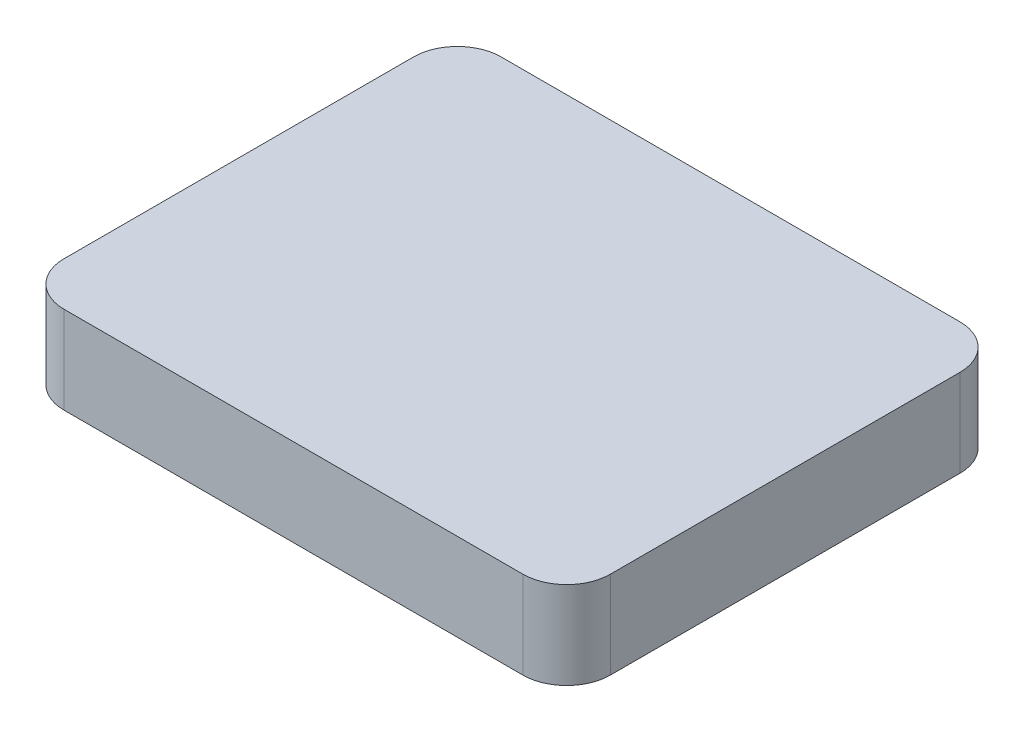
ISO-10303-21;
HEADER;
FILE_DESCRIPTION(('STEP AP214'),'2;1');
FILE_NAME('part.step','',(''),(''),'','','');
FILE_SCHEMA(('AUTOMOTIVE_DESIGN { 1 0 10303 214 1 1 1 1 }'));
ENDSEC;
DATA;
#1=APPLICATION_CONTEXT('core data for automotive mechanical design processes');
#2=APPLICATION_PROTOCOL_DEFINITION('international standard','automotive_design',2000,#1);
#3=PRODUCT_CONTEXT('',#1,'mechanical');
#4=PRODUCT('Part','Part','',(#3));
#5=PRODUCT_RELATED_PRODUCT_CATEGORY('part','',(#4));
#6=PRODUCT_DEFINITION_FORMATION('','',#4);
#7=PRODUCT_DEFINITION_CONTEXT('part definition',#1,'design');
#8=PRODUCT_DEFINITION('design','',#6,#7);
#9=PRODUCT_DEFINITION_SHAPE('','',#8);
#10=(LENGTH_UNIT() NAMED_UNIT(*) SI_UNIT(.MILLI.,.METRE.));
#11=(NAMED_UNIT(*) PLANE_ANGLE_UNIT() SI_UNIT($,.RADIAN.));
#12=(NAMED_UNIT(*) SI_UNIT($,.STERADIAN.) SOLID_ANGLE_UNIT());
#13=UNCERTAINTY_MEASURE_WITH_UNIT(LENGTH_MEASURE(1.E-05),#10,'distance_accuracy_value','');
#14=(GEOMETRIC_REPRESENTATION_CONTEXT(3) GLOBAL_UNCERTAINTY_ASSIGNED_CONTEXT((#13)) GLOBAL_UNIT_ASSIGNED_CONTEXT((#10,
#11,#12)) REPRESENTATION_CONTEXT('',''));
#15=CARTESIAN_POINT('',(0.,0.,0.));
#16=DIRECTION('',(0.,0.,1.));
#17=DIRECTION('',(1.,0.,0.));
#18=AXIS2_PLACEMENT_3D('',#15,#16,#17);
#19=CARTESIAN_POINT('',(-57.7415976312723,40.,-64.0212264150943));
#20=DIRECTION('',(0.,-1.,0.));
#21=DIRECTION('',(0.,0.,-1.));
#22=AXIS2_PLACEMENT_3D('',#19,#20,#21);
#23=CYLINDRICAL_SURFACE('',#22,20.);
#24=CARTESIAN_POINT('',(-57.7415976312723,0.,-64.0212264150943));
#25=DIRECTION('',(0.,1.,0.));
#26=DIRECTION('',(0.,0.,-1.));
#27=AXIS2_PLACEMENT_3D('',#24,#25,#26);
#28=CIRCLE('',#27,20.);
#29=CARTESIAN_POINT('',(-57.7415976312721,0.,-84.0212264150943));
#30=VERTEX_POINT('',#29);
#31=CARTESIAN_POINT('',(-77.7415976312723,0.,-64.0212264150942));
#32=VERTEX_POINT('',#31);
#33=EDGE_CURVE('E128',#30,#32,#28,.T.);
#34=ORIENTED_EDGE('',*,*,#33,.T.);
#35=DIRECTION('',(0.,-1.,0.));
#36=VECTOR('',#35,1.);
#37=CARTESIAN_POINT('',(-77.7415976312723,40.,-64.0212264150942));
#38=LINE('',#37,#36);
#39=CARTESIAN_POINT('',(-77.7415976312723,40.,-64.0212264150942));
#40=VERTEX_POINT('',#39);
#41=EDGE_CURVE('E11',#40,#32,#38,.T.);
#42=ORIENTED_EDGE('',*,*,#41,.F.);
#43=CARTESIAN_POINT('',(-57.7415976312723,40.,-64.0212264150943));
#44=DIRECTION('',(0.,1.,0.));
#45=DIRECTION('',(0.,0.,-1.));
#46=AXIS2_PLACEMENT_3D('',#43,#44,#45);
#47=CIRCLE('',#46,20.);
#48=CARTESIAN_POINT('',(-57.7415976312721,40.,-84.0212264150943));
#49=VERTEX_POINT('',#48);
#50=EDGE_CURVE('E142',#49,#40,#47,.T.);
#51=ORIENTED_EDGE('',*,*,#50,.F.);
#52=DIRECTION('',(0.,-1.,0.));
#53=VECTOR('',#52,1.);
#54=CARTESIAN_POINT('',(-57.7415976312721,40.,-84.0212264150943));
#55=LINE('',#54,#53);
#56=EDGE_CURVE('E124',#49,#30,#55,.T.);
#57=ORIENTED_EDGE('',*,*,#56,.T.);
#58=EDGE_LOOP('',(#34,#42,#51,#57));
#59=FACE_BOUND('',#58,.T.);
#60=ADVANCED_FACE('F32',(#59),#23,.T.);
#61=CARTESIAN_POINT('',(-77.7415976312723,40.,95.9787735849055));
#62=DIRECTION('',(1.,0.,0.));
#63=DIRECTION('',(0.,0.,-1.));
#64=AXIS2_PLACEMENT_3D('',#61,#62,#63);
#65=PLANE('',#64);
#66=DIRECTION('',(0.,0.,1.));
#67=VECTOR('',#66,1.);
#68=CARTESIAN_POINT('',(-77.7415976312723,0.,95.9787735849055));
#69=LINE('',#68,#67);
#70=CARTESIAN_POINT('',(-77.7415976312723,0.,95.9787735849055));
#71=VERTEX_POINT('',#70);
#72=EDGE_CURVE('E131',#32,#71,#69,.T.);
#73=ORIENTED_EDGE('',*,*,#72,.T.);
#74=DIRECTION('',(0.,-1.,0.));
#75=VECTOR('',#74,1.);
#76=CARTESIAN_POINT('',(-77.7415976312723,40.,95.9787735849055));
#77=LINE('',#76,#75);
#78=CARTESIAN_POINT('',(-77.7415976312723,40.,95.9787735849055));
#79=VERTEX_POINT('',#78);
#80=EDGE_CURVE('E40',#79,#71,#77,.T.);
#81=ORIENTED_EDGE('',*,*,#80,.F.);
#82=DIRECTION('',(0.,0.,1.));
#83=VECTOR('',#82,1.);
#84=CARTESIAN_POINT('',(-77.7415976312723,40.,95.9787735849055));
#85=LINE('',#84,#83);
#86=EDGE_CURVE('E91',#40,#79,#85,.T.);
#87=ORIENTED_EDGE('',*,*,#86,.F.);
#88=ORIENTED_EDGE('',*,*,#41,.T.);
#89=EDGE_LOOP('',(#73,#81,#87,#88));
#90=FACE_BOUND('',#89,.T.);
#91=ADVANCED_FACE('F177',(#90),#65,.F.);
#92=CARTESIAN_POINT('',(-57.7415976312723,40.,95.9787735849057));
#93=DIRECTION('',(0.,-1.,0.));
#94=DIRECTION('',(0.,0.,-1.));
#95=AXIS2_PLACEMENT_3D('',#92,#93,#94);
#96=CYLINDRICAL_SURFACE('',#95,20.);
#97=CARTESIAN_POINT('',(-57.7415976312723,0.,95.9787735849057));
#98=DIRECTION('',(0.,1.,0.));
#99=DIRECTION('',(0.,0.,-1.));
#100=AXIS2_PLACEMENT_3D('',#97,#98,#99);
#101=CIRCLE('',#100,20.);
#102=CARTESIAN_POINT('',(-57.7415976312721,0.,115.978773584906));
#103=VERTEX_POINT('',#102);
#104=EDGE_CURVE('E133',#71,#103,#101,.T.);
#105=ORIENTED_EDGE('',*,*,#104,.T.);
#106=DIRECTION('',(0.,-1.,0.));
#107=VECTOR('',#106,1.);
#108=CARTESIAN_POINT('',(-57.7415976312721,40.,115.978773584906));
#109=LINE('',#108,#107);
#110=CARTESIAN_POINT('',(-57.7415976312721,40.,115.978773584906));
#111=VERTEX_POINT('',#110);
#112=EDGE_CURVE('E149',#111,#103,#109,.T.);
#113=ORIENTED_EDGE('',*,*,#112,.F.);
#114=CARTESIAN_POINT('',(-57.7415976312723,40.,95.9787735849057));
#115=DIRECTION('',(0.,1.,0.));
#116=DIRECTION('',(0.,0.,-1.));
#117=AXIS2_PLACEMENT_3D('',#114,#115,#116);
#118=CIRCLE('',#117,20.);
#119=EDGE_CURVE('E157',#79,#111,#118,.T.);
#120=ORIENTED_EDGE('',*,*,#119,.F.);
#121=ORIENTED_EDGE('',*,*,#80,.T.);
#122=EDGE_LOOP('',(#105,#113,#120,#121));
#123=FACE_BOUND('',#122,.T.);
#124=ADVANCED_FACE('F155',(#123),#96,.T.);
#125=CARTESIAN_POINT('',(-57.7415976312721,40.,115.978773584906));
#126=DIRECTION('',(0.,0.,-1.));
#127=DIRECTION('',(-1.,0.,0.));
#128=AXIS2_PLACEMENT_3D('',#125,#126,#127);
#129=PLANE('',#128);
#130=DIRECTION('',(1.,0.,0.));
#131=VECTOR('',#130,1.);
#132=CARTESIAN_POINT('',(-57.7415976312721,0.,115.978773584906));
#133=LINE('',#132,#131);
#134=CARTESIAN_POINT('',(152.258402368728,0.,115.978773584906));
#135=VERTEX_POINT('',#134);
#136=EDGE_CURVE('E135',#103,#135,#133,.T.);
#137=ORIENTED_EDGE('',*,*,#136,.T.);
#138=DIRECTION('',(0.,-1.,0.));
#139=VECTOR('',#138,1.);
#140=CARTESIAN_POINT('',(152.258402368728,40.,115.978773584906));
#141=LINE('',#140,#139);
#142=CARTESIAN_POINT('',(152.258402368728,40.,115.978773584906));
#143=VERTEX_POINT('',#142);
#144=EDGE_CURVE('E146',#143,#135,#141,.T.);
#145=ORIENTED_EDGE('',*,*,#144,.F.);
#146=DIRECTION('',(1.,0.,0.));
#147=VECTOR('',#146,1.);
#148=CARTESIAN_POINT('',(-57.7415976312721,40.,115.978773584906));
#149=LINE('',#148,#147);
#150=EDGE_CURVE('E169',#111,#143,#149,.T.);
#151=ORIENTED_EDGE('',*,*,#150,.F.);
#152=ORIENTED_EDGE('',*,*,#112,.T.);
#153=EDGE_LOOP('',(#137,#145,#151,#152));
#154=FACE_BOUND('',#153,.T.);
#155=ADVANCED_FACE('F165',(#154),#129,.F.);
#156=CARTESIAN_POINT('',(152.258402368728,40.,95.9787735849057));
#157=DIRECTION('',(0.,-1.,0.));
#158=DIRECTION('',(0.,0.,-1.));
#159=AXIS2_PLACEMENT_3D('',#156,#157,#158);
#160=CYLINDRICAL_SURFACE('',#159,20.);
#161=CARTESIAN_POINT('',(152.258402368728,0.,95.9787735849057));
#162=DIRECTION('',(0.,1.,0.));
#163=DIRECTION('',(0.,0.,1.));
#164=AXIS2_PLACEMENT_3D('',#161,#162,#163);
#165=CIRCLE('',#164,20.);
#166=CARTESIAN_POINT('',(172.258402368728,0.,95.9787735849055));
#167=VERTEX_POINT('',#166);
#168=EDGE_CURVE('E137',#135,#167,#165,.T.);
#169=ORIENTED_EDGE('',*,*,#168,.T.);
#170=DIRECTION('',(0.,-1.,0.));
#171=VECTOR('',#170,1.);
#172=CARTESIAN_POINT('',(172.258402368728,40.,95.9787735849055));
#173=LINE('',#172,#171);
#174=CARTESIAN_POINT('',(172.258402368728,40.,95.9787735849055));
#175=VERTEX_POINT('',#174);
#176=EDGE_CURVE('E119',#175,#167,#173,.T.);
#177=ORIENTED_EDGE('',*,*,#176,.F.);
#178=CARTESIAN_POINT('',(152.258402368728,40.,95.9787735849057));
#179=DIRECTION('',(0.,1.,0.));
#180=DIRECTION('',(0.,0.,1.));
#181=AXIS2_PLACEMENT_3D('',#178,#179,#180);
#182=CIRCLE('',#181,20.);
#183=EDGE_CURVE('E110',#143,#175,#182,.T.);
#184=ORIENTED_EDGE('',*,*,#183,.F.);
#185=ORIENTED_EDGE('',*,*,#144,.T.);
#186=EDGE_LOOP('',(#169,#177,#184,#185));
#187=FACE_BOUND('',#186,.T.);
#188=ADVANCED_FACE('F168',(#187),#160,.T.);
#189=CARTESIAN_POINT('',(172.258402368728,40.,95.9787735849055));
#190=DIRECTION('',(-1.,0.,0.));
#191=DIRECTION('',(0.,0.,1.));
#192=AXIS2_PLACEMENT_3D('',#189,#190,#191);
#193=PLANE('',#192);
#194=DIRECTION('',(0.,0.,-1.));
#195=VECTOR('',#194,1.);
#196=CARTESIAN_POINT('',(172.258402368728,0.,95.9787735849055));
#197=LINE('',#196,#195);
#198=CARTESIAN_POINT('',(172.258402368728,0.,-64.0212264150942));
#199=VERTEX_POINT('',#198);
#200=EDGE_CURVE('E118',#167,#199,#197,.T.);
#201=ORIENTED_EDGE('',*,*,#200,.T.);
#202=DIRECTION('',(0.,-1.,0.));
#203=VECTOR('',#202,1.);
#204=CARTESIAN_POINT('',(172.258402368728,40.,-64.0212264150942));
#205=LINE('',#204,#203);
#206=CARTESIAN_POINT('',(172.258402368728,40.,-64.0212264150942));
#207=VERTEX_POINT('',#206);
#208=EDGE_CURVE('E115',#207,#199,#205,.T.);
#209=ORIENTED_EDGE('',*,*,#208,.F.);
#210=DIRECTION('',(0.,0.,-1.));
#211=VECTOR('',#210,1.);
#212=CARTESIAN_POINT('',(172.258402368728,40.,95.9787735849055));
#213=LINE('',#212,#211);
#214=EDGE_CURVE('E104',#175,#207,#213,.T.);
#215=ORIENTED_EDGE('',*,*,#214,.F.);
#216=ORIENTED_EDGE('',*,*,#176,.T.);
#217=EDGE_LOOP('',(#201,#209,#215,#216));
#218=FACE_BOUND('',#217,.T.);
#219=ADVANCED_FACE('F116',(#218),#193,.F.);
#220=CARTESIAN_POINT('',(152.258402368728,40.,-64.0212264150943));
#221=DIRECTION('',(0.,-1.,0.));
#222=DIRECTION('',(0.,0.,-1.));
#223=AXIS2_PLACEMENT_3D('',#220,#221,#222);
#224=CYLINDRICAL_SURFACE('',#223,20.);
#225=CARTESIAN_POINT('',(152.258402368728,0.,-64.0212264150943));
#226=DIRECTION('',(0.,1.,0.));
#227=DIRECTION('',(0.,0.,-1.));
#228=AXIS2_PLACEMENT_3D('',#225,#226,#227);
#229=CIRCLE('',#228,20.);
#230=CARTESIAN_POINT('',(152.258402368728,0.,-84.0212264150943));
#231=VERTEX_POINT('',#230);
#232=EDGE_CURVE('E77',#199,#231,#229,.T.);
#233=ORIENTED_EDGE('',*,*,#232,.T.);
#234=DIRECTION('',(0.,-1.,0.));
#235=VECTOR('',#234,1.);
#236=CARTESIAN_POINT('',(152.258402368728,40.,-84.0212264150943));
#237=LINE('',#236,#235);
#238=CARTESIAN_POINT('',(152.258402368728,40.,-84.0212264150943));
#239=VERTEX_POINT('',#238);
#240=EDGE_CURVE('E120',#239,#231,#237,.T.);
#241=ORIENTED_EDGE('',*,*,#240,.F.);
#242=CARTESIAN_POINT('',(152.258402368728,40.,-64.0212264150943));
#243=DIRECTION('',(0.,1.,0.));
#244=DIRECTION('',(0.,0.,-1.));
#245=AXIS2_PLACEMENT_3D('',#242,#243,#244);
#246=CIRCLE('',#245,20.);
#247=EDGE_CURVE('E108',#207,#239,#246,.T.);
#248=ORIENTED_EDGE('',*,*,#247,.F.);
#249=ORIENTED_EDGE('',*,*,#208,.T.);
#250=EDGE_LOOP('',(#233,#241,#248,#249));
#251=FACE_BOUND('',#250,.T.);
#252=ADVANCED_FACE('F122',(#251),#224,.T.);
#253=CARTESIAN_POINT('',(-57.7415976312721,40.,-84.0212264150943));
#254=DIRECTION('',(0.,0.,1.));
#255=DIRECTION('',(1.,0.,0.));
#256=AXIS2_PLACEMENT_3D('',#253,#254,#255);
#257=PLANE('',#256);
#258=DIRECTION('',(-1.,0.,0.));
#259=VECTOR('',#258,1.);
#260=CARTESIAN_POINT('',(-57.7415976312721,0.,-84.0212264150943));
#261=LINE('',#260,#259);
#262=EDGE_CURVE('E83',#231,#30,#261,.T.);
#263=ORIENTED_EDGE('',*,*,#262,.T.);
#264=ORIENTED_EDGE('',*,*,#56,.F.);
#265=DIRECTION('',(-1.,0.,0.));
#266=VECTOR('',#265,1.);
#267=CARTESIAN_POINT('',(-57.7415976312721,40.,-84.0212264150943));
#268=LINE('',#267,#266);
#269=EDGE_CURVE('E48',#239,#49,#268,.T.);
#270=ORIENTED_EDGE('',*,*,#269,.F.);
#271=ORIENTED_EDGE('',*,*,#240,.T.);
#272=EDGE_LOOP('',(#263,#264,#270,#271));
#273=FACE_BOUND('',#272,.T.);
#274=ADVANCED_FACE('F193',(#273),#257,.F.);
#275=CARTESIAN_POINT('',(-57.7415976312723,40.,-64.0212264150943));
#276=DIRECTION('',(0.,-1.,0.));
#277=DIRECTION('',(0.,0.,-1.));
#278=AXIS2_PLACEMENT_3D('',#275,#276,#277);
#279=PLANE('',#278);
#280=ORIENTED_EDGE('',*,*,#50,.T.);
#281=ORIENTED_EDGE('',*,*,#86,.T.);
#282=ORIENTED_EDGE('',*,*,#119,.T.);
#283=ORIENTED_EDGE('',*,*,#150,.T.);
#284=ORIENTED_EDGE('',*,*,#183,.T.);
#285=ORIENTED_EDGE('',*,*,#214,.T.);
#286=ORIENTED_EDGE('',*,*,#247,.T.);
#287=ORIENTED_EDGE('',*,*,#269,.T.);
#288=EDGE_LOOP('',(#280,#281,#282,#283,#284,#285,#286,#287));
#289=FACE_BOUND('',#288,.T.);
#290=ADVANCED_FACE('F106',(#289),#279,.F.);
#291=CARTESIAN_POINT('',(-57.7415976312723,0.,-64.0212264150943));
#292=DIRECTION('',(0.,-1.,0.));
#293=DIRECTION('',(0.,0.,-1.));
#294=AXIS2_PLACEMENT_3D('',#291,#292,#293);
#295=PLANE('',#294);
#296=ORIENTED_EDGE('',*,*,#33,.F.);
#297=ORIENTED_EDGE('',*,*,#262,.F.);
#298=ORIENTED_EDGE('',*,*,#232,.F.);
#299=ORIENTED_EDGE('',*,*,#200,.F.);
#300=ORIENTED_EDGE('',*,*,#168,.F.);
#301=ORIENTED_EDGE('',*,*,#136,.F.);
#302=ORIENTED_EDGE('',*,*,#104,.F.);
#303=ORIENTED_EDGE('',*,*,#72,.F.);
#304=EDGE_LOOP('',(#296,#297,#298,#299,#300,#301,#302,#303));
#305=FACE_BOUND('',#304,.T.);
#306=ADVANCED_FACE('F161',(#305),#295,.T.);
#307=CLOSED_SHELL('',(#60,#91,#124,#155,#188,#219,#252,#274,#290,#306));
#308=MANIFOLD_SOLID_BREP('B2',#307);
#309=ADVANCED_BREP_SHAPE_REPRESENTATION('',(#18,#308),#14);
#310=SHAPE_DEFINITION_REPRESENTATION(#9,#309);
ENDSEC;
END-ISO-10303-21;
